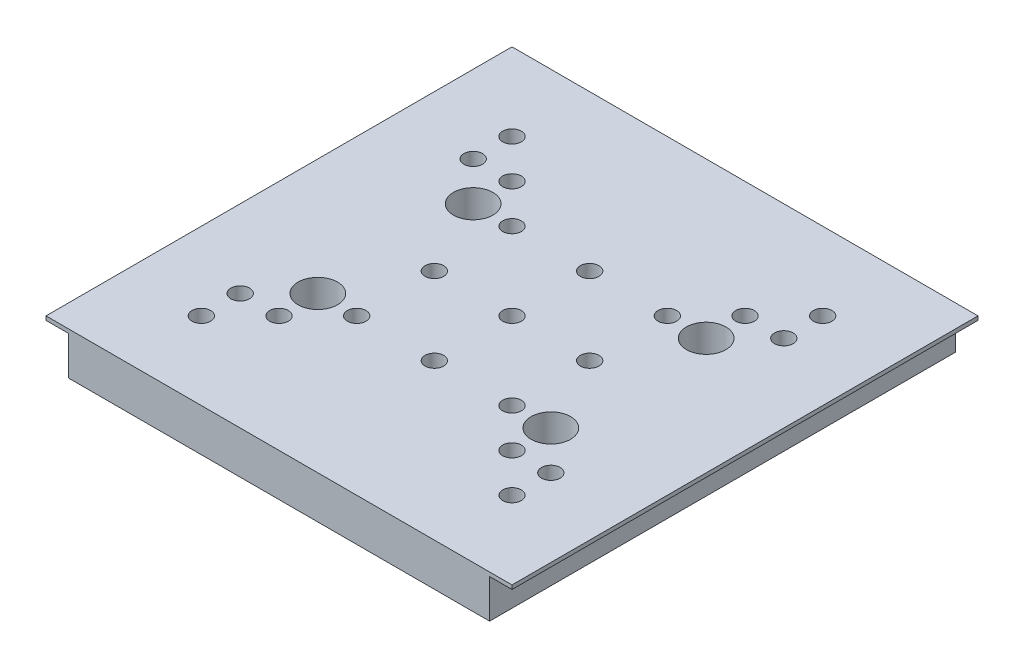
ISO-10303-21;
HEADER;
FILE_DESCRIPTION(('STEP AP214'),'2;1');
FILE_NAME('part.step','',(''),(''),'','','');
FILE_SCHEMA(('AUTOMOTIVE_DESIGN { 1 0 10303 214 1 1 1 1 }'));
ENDSEC;
DATA;
#1=APPLICATION_CONTEXT('core data for automotive mechanical design processes');
#2=APPLICATION_PROTOCOL_DEFINITION('international standard','automotive_design',2000,#1);
#3=PRODUCT_CONTEXT('',#1,'mechanical');
#4=PRODUCT('Part','Part','',(#3));
#5=PRODUCT_RELATED_PRODUCT_CATEGORY('part','',(#4));
#6=PRODUCT_DEFINITION_FORMATION('','',#4);
#7=PRODUCT_DEFINITION_CONTEXT('part definition',#1,'design');
#8=PRODUCT_DEFINITION('design','',#6,#7);
#9=PRODUCT_DEFINITION_SHAPE('','',#8);
#10=(LENGTH_UNIT() NAMED_UNIT(*) SI_UNIT(.MILLI.,.METRE.));
#11=(NAMED_UNIT(*) PLANE_ANGLE_UNIT() SI_UNIT($,.RADIAN.));
#12=(NAMED_UNIT(*) SI_UNIT($,.STERADIAN.) SOLID_ANGLE_UNIT());
#13=UNCERTAINTY_MEASURE_WITH_UNIT(LENGTH_MEASURE(1.E-05),#10,'distance_accuracy_value','');
#14=(GEOMETRIC_REPRESENTATION_CONTEXT(3) GLOBAL_UNCERTAINTY_ASSIGNED_CONTEXT((#13)) GLOBAL_UNIT_ASSIGNED_CONTEXT((#10,
#11,#12)) REPRESENTATION_CONTEXT('',''));
#15=CARTESIAN_POINT('',(0.,0.,0.));
#16=DIRECTION('',(0.,0.,1.));
#17=DIRECTION('',(1.,0.,0.));
#18=AXIS2_PLACEMENT_3D('',#15,#16,#17);
#19=CARTESIAN_POINT('',(75.,13.716,75.));
#20=DIRECTION('',(0.,-1.,0.));
#21=DIRECTION('',(0.,0.,-1.));
#22=AXIS2_PLACEMENT_3D('',#19,#20,#21);
#23=PLANE('',#22);
#24=CARTESIAN_POINT('',(50.,13.716,37.5));
#25=DIRECTION('',(0.,1.,0.));
#26=DIRECTION('',(0.,0.,1.));
#27=AXIS2_PLACEMENT_3D('',#24,#25,#26);
#28=CIRCLE('',#27,2.99999999999999);
#29=CARTESIAN_POINT('',(50.,13.716,40.5));
#30=VERTEX_POINT('',#29);
#31=EDGE_CURVE('E252',#30,#30,#28,.T.);
#32=ORIENTED_EDGE('',*,*,#31,.F.);
#33=EDGE_LOOP('',(#32));
#34=FACE_BOUND('',#33,.T.);
#35=CARTESIAN_POINT('',(25.,13.716,25.));
#36=DIRECTION('',(0.,1.,0.));
#37=DIRECTION('',(0.,0.,1.));
#38=AXIS2_PLACEMENT_3D('',#35,#36,#37);
#39=CIRCLE('',#38,2.99999999999999);
#40=CARTESIAN_POINT('',(25.,13.716,28.));
#41=VERTEX_POINT('',#40);
#42=EDGE_CURVE('E267',#41,#41,#39,.T.);
#43=ORIENTED_EDGE('',*,*,#42,.F.);
#44=EDGE_LOOP('',(#43));
#45=FACE_BOUND('',#44,.T.);
#46=CARTESIAN_POINT('',(50.,13.716,-37.5));
#47=DIRECTION('',(0.,1.,0.));
#48=DIRECTION('',(0.,0.,1.));
#49=AXIS2_PLACEMENT_3D('',#46,#47,#48);
#50=CIRCLE('',#49,2.99999999999999);
#51=CARTESIAN_POINT('',(50.,13.716,-34.5));
#52=VERTEX_POINT('',#51);
#53=EDGE_CURVE('E274',#52,#52,#50,.T.);
#54=ORIENTED_EDGE('',*,*,#53,.F.);
#55=EDGE_LOOP('',(#54));
#56=FACE_BOUND('',#55,.T.);
#57=CARTESIAN_POINT('',(25.,13.716,-25.));
#58=DIRECTION('',(0.,1.,0.));
#59=DIRECTION('',(0.,0.,1.));
#60=AXIS2_PLACEMENT_3D('',#57,#58,#59);
#61=CIRCLE('',#60,2.99999999999999);
#62=CARTESIAN_POINT('',(25.,13.716,-22.));
#63=VERTEX_POINT('',#62);
#64=EDGE_CURVE('E287',#63,#63,#61,.T.);
#65=ORIENTED_EDGE('',*,*,#64,.F.);
#66=EDGE_LOOP('',(#65));
#67=FACE_BOUND('',#66,.T.);
#68=CARTESIAN_POINT('',(-37.5,13.716,37.5));
#69=DIRECTION('',(0.,1.,0.));
#70=DIRECTION('',(0.,0.,1.));
#71=AXIS2_PLACEMENT_3D('',#68,#69,#70);
#72=CIRCLE('',#71,2.99999999999999);
#73=CARTESIAN_POINT('',(-37.5,13.716,40.5));
#74=VERTEX_POINT('',#73);
#75=EDGE_CURVE('E294',#74,#74,#72,.T.);
#76=ORIENTED_EDGE('',*,*,#75,.F.);
#77=EDGE_LOOP('',(#76));
#78=FACE_BOUND('',#77,.T.);
#79=CARTESIAN_POINT('',(-50.,13.716,50.));
#80=DIRECTION('',(0.,1.,0.));
#81=DIRECTION('',(0.,0.,1.));
#82=AXIS2_PLACEMENT_3D('',#79,#80,#81);
#83=CIRCLE('',#82,2.99999999999999);
#84=CARTESIAN_POINT('',(-50.,13.716,53.));
#85=VERTEX_POINT('',#84);
#86=EDGE_CURVE('E304',#85,#85,#83,.T.);
#87=ORIENTED_EDGE('',*,*,#86,.F.);
#88=EDGE_LOOP('',(#87));
#89=FACE_BOUND('',#88,.T.);
#90=CARTESIAN_POINT('',(0.,13.716,25.));
#91=DIRECTION('',(0.,1.,0.));
#92=DIRECTION('',(0.,0.,1.));
#93=AXIS2_PLACEMENT_3D('',#90,#91,#92);
#94=CIRCLE('',#93,2.99999999999999);
#95=CARTESIAN_POINT('',(0.,13.716,28.));
#96=VERTEX_POINT('',#95);
#97=EDGE_CURVE('E317',#96,#96,#94,.T.);
#98=ORIENTED_EDGE('',*,*,#97,.F.);
#99=EDGE_LOOP('',(#98));
#100=FACE_BOUND('',#99,.T.);
#101=CARTESIAN_POINT('',(-50.,13.716,-37.5));
#102=DIRECTION('',(0.,1.,0.));
#103=DIRECTION('',(0.,0.,1.));
#104=AXIS2_PLACEMENT_3D('',#101,#102,#103);
#105=CIRCLE('',#104,2.99999999999999);
#106=CARTESIAN_POINT('',(-50.,13.716,-34.5));
#107=VERTEX_POINT('',#106);
#108=EDGE_CURVE('E324',#107,#107,#105,.T.);
#109=ORIENTED_EDGE('',*,*,#108,.F.);
#110=EDGE_LOOP('',(#109));
#111=FACE_BOUND('',#110,.T.);
#112=CARTESIAN_POINT('',(-25.,13.716,-25.));
#113=DIRECTION('',(0.,1.,0.));
#114=DIRECTION('',(0.,0.,1.));
#115=AXIS2_PLACEMENT_3D('',#112,#113,#114);
#116=CIRCLE('',#115,2.99999999999999);
#117=CARTESIAN_POINT('',(-25.,13.716,-22.));
#118=VERTEX_POINT('',#117);
#119=EDGE_CURVE('E11',#118,#118,#116,.T.);
#120=ORIENTED_EDGE('',*,*,#119,.F.);
#121=EDGE_LOOP('',(#120));
#122=FACE_BOUND('',#121,.T.);
#123=CARTESIAN_POINT('',(0.,13.716,-25.));
#124=DIRECTION('',(0.,1.,0.));
#125=DIRECTION('',(0.,0.,1.));
#126=AXIS2_PLACEMENT_3D('',#123,#124,#125);
#127=CIRCLE('',#126,2.99999999999999);
#128=CARTESIAN_POINT('',(0.,13.716,-22.));
#129=VERTEX_POINT('',#128);
#130=EDGE_CURVE('E166',#129,#129,#127,.T.);
#131=ORIENTED_EDGE('',*,*,#130,.F.);
#132=EDGE_LOOP('',(#131));
#133=FACE_BOUND('',#132,.T.);
#134=DIRECTION('',(-1.,0.,0.));
#135=VECTOR('',#134,1.);
#136=CARTESIAN_POINT('',(75.,13.716,-75.));
#137=LINE('',#136,#135);
#138=CARTESIAN_POINT('',(75.,13.716,-75.));
#139=VERTEX_POINT('',#138);
#140=CARTESIAN_POINT('',(-75.,13.716,-75.));
#141=VERTEX_POINT('',#140);
#142=EDGE_CURVE('E141',#139,#141,#137,.T.);
#143=ORIENTED_EDGE('',*,*,#142,.T.);
#144=DIRECTION('',(0.,0.,-1.));
#145=VECTOR('',#144,1.);
#146=CARTESIAN_POINT('',(-75.,13.716,75.));
#147=LINE('',#146,#145);
#148=CARTESIAN_POINT('',(-75.,13.716,75.));
#149=VERTEX_POINT('',#148);
#150=EDGE_CURVE('E152',#149,#141,#147,.T.);
#151=ORIENTED_EDGE('',*,*,#150,.F.);
#152=DIRECTION('',(-1.,0.,0.));
#153=VECTOR('',#152,1.);
#154=CARTESIAN_POINT('',(75.,13.716,75.));
#155=LINE('',#154,#153);
#156=CARTESIAN_POINT('',(75.,13.716,75.));
#157=VERTEX_POINT('',#156);
#158=EDGE_CURVE('E361',#157,#149,#155,.T.);
#159=ORIENTED_EDGE('',*,*,#158,.F.);
#160=DIRECTION('',(0.,0.,-1.));
#161=VECTOR('',#160,1.);
#162=CARTESIAN_POINT('',(75.,13.716,75.));
#163=LINE('',#162,#161);
#164=EDGE_CURVE('E155',#157,#139,#163,.T.);
#165=ORIENTED_EDGE('',*,*,#164,.T.);
#166=EDGE_LOOP('',(#143,#151,#159,#165));
#167=FACE_BOUND('',#166,.T.);
#168=CARTESIAN_POINT('',(-37.5,13.716,-25.));
#169=DIRECTION('',(0.,1.,0.));
#170=DIRECTION('',(0.,0.,1.));
#171=AXIS2_PLACEMENT_3D('',#168,#169,#170);
#172=CIRCLE('',#171,6.34999999999999);
#173=CARTESIAN_POINT('',(-37.5,13.716,-18.65));
#174=VERTEX_POINT('',#173);
#175=EDGE_CURVE('E192',#174,#174,#172,.T.);
#176=ORIENTED_EDGE('',*,*,#175,.F.);
#177=EDGE_LOOP('',(#176));
#178=FACE_BOUND('',#177,.T.);
#179=CARTESIAN_POINT('',(37.5,13.716,-25.));
#180=DIRECTION('',(0.,1.,0.));
#181=DIRECTION('',(0.,0.,1.));
#182=AXIS2_PLACEMENT_3D('',#179,#180,#181);
#183=CIRCLE('',#182,6.34999999999999);
#184=CARTESIAN_POINT('',(37.5,13.716,-18.65));
#185=VERTEX_POINT('',#184);
#186=EDGE_CURVE('E196',#185,#185,#183,.T.);
#187=ORIENTED_EDGE('',*,*,#186,.F.);
#188=EDGE_LOOP('',(#187));
#189=FACE_BOUND('',#188,.T.);
#190=CARTESIAN_POINT('',(37.5,13.716,25.));
#191=DIRECTION('',(0.,1.,0.));
#192=DIRECTION('',(0.,0.,1.));
#193=AXIS2_PLACEMENT_3D('',#190,#191,#192);
#194=CIRCLE('',#193,6.34999999999999);
#195=CARTESIAN_POINT('',(37.5,13.716,31.35));
#196=VERTEX_POINT('',#195);
#197=EDGE_CURVE('E200',#196,#196,#194,.T.);
#198=ORIENTED_EDGE('',*,*,#197,.F.);
#199=EDGE_LOOP('',(#198));
#200=FACE_BOUND('',#199,.T.);
#201=CARTESIAN_POINT('',(-37.5,13.716,25.));
#202=DIRECTION('',(0.,1.,0.));
#203=DIRECTION('',(0.,0.,1.));
#204=AXIS2_PLACEMENT_3D('',#201,#202,#203);
#205=CIRCLE('',#204,6.34999999999999);
#206=CARTESIAN_POINT('',(-37.5,13.716,31.35));
#207=VERTEX_POINT('',#206);
#208=EDGE_CURVE('E204',#207,#207,#205,.T.);
#209=ORIENTED_EDGE('',*,*,#208,.F.);
#210=EDGE_LOOP('',(#209));
#211=FACE_BOUND('',#210,.T.);
#212=CARTESIAN_POINT('',(0.,13.716,0.));
#213=DIRECTION('',(0.,1.,0.));
#214=DIRECTION('',(0.,0.,1.));
#215=AXIS2_PLACEMENT_3D('',#212,#213,#214);
#216=CIRCLE('',#215,2.99999999999999);
#217=CARTESIAN_POINT('',(0.,13.716,2.99999999999999));
#218=VERTEX_POINT('',#217);
#219=EDGE_CURVE('E208',#218,#218,#216,.T.);
#220=ORIENTED_EDGE('',*,*,#219,.F.);
#221=EDGE_LOOP('',(#220));
#222=FACE_BOUND('',#221,.T.);
#223=CARTESIAN_POINT('',(-25.,13.716,0.));
#224=DIRECTION('',(0.,1.,0.));
#225=DIRECTION('',(0.,0.,1.));
#226=AXIS2_PLACEMENT_3D('',#223,#224,#225);
#227=CIRCLE('',#226,2.99999999999999);
#228=CARTESIAN_POINT('',(-25.,13.716,2.99999999999999));
#229=VERTEX_POINT('',#228);
#230=EDGE_CURVE('E212',#229,#229,#227,.T.);
#231=ORIENTED_EDGE('',*,*,#230,.F.);
#232=EDGE_LOOP('',(#231));
#233=FACE_BOUND('',#232,.T.);
#234=CARTESIAN_POINT('',(-50.,13.716,-50.));
#235=DIRECTION('',(0.,1.,0.));
#236=DIRECTION('',(0.,0.,1.));
#237=AXIS2_PLACEMENT_3D('',#234,#235,#236);
#238=CIRCLE('',#237,2.99999999999999);
#239=CARTESIAN_POINT('',(-50.,13.716,-47.));
#240=VERTEX_POINT('',#239);
#241=EDGE_CURVE('E216',#240,#240,#238,.T.);
#242=ORIENTED_EDGE('',*,*,#241,.F.);
#243=EDGE_LOOP('',(#242));
#244=FACE_BOUND('',#243,.T.);
#245=CARTESIAN_POINT('',(-37.5,13.716,-37.5));
#246=DIRECTION('',(0.,1.,0.));
#247=DIRECTION('',(0.,0.,1.));
#248=AXIS2_PLACEMENT_3D('',#245,#246,#247);
#249=CIRCLE('',#248,2.99999999999999);
#250=CARTESIAN_POINT('',(-37.5,13.716,-34.5));
#251=VERTEX_POINT('',#250);
#252=EDGE_CURVE('E220',#251,#251,#249,.T.);
#253=ORIENTED_EDGE('',*,*,#252,.F.);
#254=EDGE_LOOP('',(#253));
#255=FACE_BOUND('',#254,.T.);
#256=CARTESIAN_POINT('',(-25.,13.716,25.));
#257=DIRECTION('',(0.,1.,0.));
#258=DIRECTION('',(0.,0.,1.));
#259=AXIS2_PLACEMENT_3D('',#256,#257,#258);
#260=CIRCLE('',#259,2.99999999999999);
#261=CARTESIAN_POINT('',(-25.,13.716,28.));
#262=VERTEX_POINT('',#261);
#263=EDGE_CURVE('E224',#262,#262,#260,.T.);
#264=ORIENTED_EDGE('',*,*,#263,.F.);
#265=EDGE_LOOP('',(#264));
#266=FACE_BOUND('',#265,.T.);
#267=CARTESIAN_POINT('',(-50.,13.716,37.5));
#268=DIRECTION('',(0.,1.,0.));
#269=DIRECTION('',(0.,0.,1.));
#270=AXIS2_PLACEMENT_3D('',#267,#268,#269);
#271=CIRCLE('',#270,2.99999999999999);
#272=CARTESIAN_POINT('',(-50.,13.716,40.5));
#273=VERTEX_POINT('',#272);
#274=EDGE_CURVE('E228',#273,#273,#271,.T.);
#275=ORIENTED_EDGE('',*,*,#274,.F.);
#276=EDGE_LOOP('',(#275));
#277=FACE_BOUND('',#276,.T.);
#278=CARTESIAN_POINT('',(25.,13.716,0.));
#279=DIRECTION('',(0.,1.,0.));
#280=DIRECTION('',(0.,0.,1.));
#281=AXIS2_PLACEMENT_3D('',#278,#279,#280);
#282=CIRCLE('',#281,2.99999999999999);
#283=CARTESIAN_POINT('',(25.,13.716,2.99999999999999));
#284=VERTEX_POINT('',#283);
#285=EDGE_CURVE('E232',#284,#284,#282,.T.);
#286=ORIENTED_EDGE('',*,*,#285,.F.);
#287=EDGE_LOOP('',(#286));
#288=FACE_BOUND('',#287,.T.);
#289=CARTESIAN_POINT('',(50.,13.716,-50.));
#290=DIRECTION('',(0.,1.,0.));
#291=DIRECTION('',(0.,0.,1.));
#292=AXIS2_PLACEMENT_3D('',#289,#290,#291);
#293=CIRCLE('',#292,2.99999999999999);
#294=CARTESIAN_POINT('',(50.,13.716,-47.));
#295=VERTEX_POINT('',#294);
#296=EDGE_CURVE('E236',#295,#295,#293,.T.);
#297=ORIENTED_EDGE('',*,*,#296,.F.);
#298=EDGE_LOOP('',(#297));
#299=FACE_BOUND('',#298,.T.);
#300=CARTESIAN_POINT('',(37.5,13.716,-37.5));
#301=DIRECTION('',(0.,1.,0.));
#302=DIRECTION('',(0.,0.,1.));
#303=AXIS2_PLACEMENT_3D('',#300,#301,#302);
#304=CIRCLE('',#303,2.99999999999999);
#305=CARTESIAN_POINT('',(37.5,13.716,-34.5));
#306=VERTEX_POINT('',#305);
#307=EDGE_CURVE('E240',#306,#306,#304,.T.);
#308=ORIENTED_EDGE('',*,*,#307,.F.);
#309=EDGE_LOOP('',(#308));
#310=FACE_BOUND('',#309,.T.);
#311=CARTESIAN_POINT('',(50.,13.716,50.));
#312=DIRECTION('',(0.,1.,0.));
#313=DIRECTION('',(0.,0.,1.));
#314=AXIS2_PLACEMENT_3D('',#311,#312,#313);
#315=CIRCLE('',#314,2.99999999999999);
#316=CARTESIAN_POINT('',(50.,13.716,53.));
#317=VERTEX_POINT('',#316);
#318=EDGE_CURVE('E244',#317,#317,#315,.T.);
#319=ORIENTED_EDGE('',*,*,#318,.F.);
#320=EDGE_LOOP('',(#319));
#321=FACE_BOUND('',#320,.T.);
#322=CARTESIAN_POINT('',(37.5,13.716,37.5));
#323=DIRECTION('',(0.,1.,0.));
#324=DIRECTION('',(0.,0.,1.));
#325=AXIS2_PLACEMENT_3D('',#322,#323,#324);
#326=CIRCLE('',#325,2.99999999999999);
#327=CARTESIAN_POINT('',(37.5,13.716,40.5));
#328=VERTEX_POINT('',#327);
#329=EDGE_CURVE('E247',#328,#328,#326,.T.);
#330=ORIENTED_EDGE('',*,*,#329,.F.);
#331=EDGE_LOOP('',(#330));
#332=FACE_BOUND('',#331,.T.);
#333=ADVANCED_FACE('F35',(#34,#45,#56,#67,#78,#89,#100,#111,#122,#133,#167,#178,#189,#200,#211,
#222,#233,#244,#255,#266,#277,#288,#299,#310,#321,#332),#23,.F.);
#334=CARTESIAN_POINT('',(67.79,0.,75.));
#335=DIRECTION('',(-1.,0.,0.));
#336=DIRECTION('',(0.,0.,1.));
#337=AXIS2_PLACEMENT_3D('',#334,#335,#336);
#338=PLANE('',#337);
#339=DIRECTION('',(0.,1.,0.));
#340=VECTOR('',#339,1.);
#341=CARTESIAN_POINT('',(67.79,0.,-75.));
#342=LINE('',#341,#340);
#343=CARTESIAN_POINT('',(67.79,0.,-75.));
#344=VERTEX_POINT('',#343);
#345=CARTESIAN_POINT('',(67.79,12.446,-75.));
#346=VERTEX_POINT('',#345);
#347=EDGE_CURVE('E133',#344,#346,#342,.T.);
#348=ORIENTED_EDGE('',*,*,#347,.T.);
#349=DIRECTION('',(0.,0.,-1.));
#350=VECTOR('',#349,1.);
#351=CARTESIAN_POINT('',(67.79,12.446,75.));
#352=LINE('',#351,#350);
#353=CARTESIAN_POINT('',(67.79,12.446,75.));
#354=VERTEX_POINT('',#353);
#355=EDGE_CURVE('E161',#354,#346,#352,.T.);
#356=ORIENTED_EDGE('',*,*,#355,.F.);
#357=DIRECTION('',(0.,1.,0.));
#358=VECTOR('',#357,1.);
#359=CARTESIAN_POINT('',(67.79,0.,75.));
#360=LINE('',#359,#358);
#361=CARTESIAN_POINT('',(67.79,0.,75.));
#362=VERTEX_POINT('',#361);
#363=EDGE_CURVE('E148',#362,#354,#360,.T.);
#364=ORIENTED_EDGE('',*,*,#363,.F.);
#365=DIRECTION('',(0.,0.,-1.));
#366=VECTOR('',#365,1.);
#367=CARTESIAN_POINT('',(67.79,0.,75.));
#368=LINE('',#367,#366);
#369=EDGE_CURVE('E129',#362,#344,#368,.T.);
#370=ORIENTED_EDGE('',*,*,#369,.T.);
#371=EDGE_LOOP('',(#348,#356,#364,#370));
#372=FACE_BOUND('',#371,.T.);
#373=ADVANCED_FACE('F181',(#372),#338,.F.);
#374=CARTESIAN_POINT('',(67.79,12.446,75.));
#375=DIRECTION('',(0.,1.,0.));
#376=DIRECTION('',(0.,0.,1.));
#377=AXIS2_PLACEMENT_3D('',#374,#375,#376);
#378=PLANE('',#377);
#379=DIRECTION('',(1.,0.,0.));
#380=VECTOR('',#379,1.);
#381=CARTESIAN_POINT('',(67.79,12.446,-75.));
#382=LINE('',#381,#380);
#383=CARTESIAN_POINT('',(75.,12.446,-75.));
#384=VERTEX_POINT('',#383);
#385=EDGE_CURVE('E136',#346,#384,#382,.T.);
#386=ORIENTED_EDGE('',*,*,#385,.T.);
#387=DIRECTION('',(0.,0.,-1.));
#388=VECTOR('',#387,1.);
#389=CARTESIAN_POINT('',(75.,12.446,75.));
#390=LINE('',#389,#388);
#391=CARTESIAN_POINT('',(75.,12.446,75.));
#392=VERTEX_POINT('',#391);
#393=EDGE_CURVE('E158',#392,#384,#390,.T.);
#394=ORIENTED_EDGE('',*,*,#393,.F.);
#395=DIRECTION('',(1.,0.,0.));
#396=VECTOR('',#395,1.);
#397=CARTESIAN_POINT('',(67.79,12.446,75.));
#398=LINE('',#397,#396);
#399=EDGE_CURVE('E96',#354,#392,#398,.T.);
#400=ORIENTED_EDGE('',*,*,#399,.F.);
#401=ORIENTED_EDGE('',*,*,#355,.T.);
#402=EDGE_LOOP('',(#386,#394,#400,#401));
#403=FACE_BOUND('',#402,.T.);
#404=ADVANCED_FACE('F393',(#403),#378,.F.);
#405=CARTESIAN_POINT('',(75.,12.446,75.));
#406=DIRECTION('',(-1.,0.,0.));
#407=DIRECTION('',(0.,0.,1.));
#408=AXIS2_PLACEMENT_3D('',#405,#406,#407);
#409=PLANE('',#408);
#410=DIRECTION('',(0.,1.,0.));
#411=VECTOR('',#410,1.);
#412=CARTESIAN_POINT('',(75.,12.446,-75.));
#413=LINE('',#412,#411);
#414=EDGE_CURVE('E139',#384,#139,#413,.T.);
#415=ORIENTED_EDGE('',*,*,#414,.T.);
#416=ORIENTED_EDGE('',*,*,#164,.F.);
#417=DIRECTION('',(0.,1.,0.));
#418=VECTOR('',#417,1.);
#419=CARTESIAN_POINT('',(75.,12.446,75.));
#420=LINE('',#419,#418);
#421=EDGE_CURVE('E359',#392,#157,#420,.T.);
#422=ORIENTED_EDGE('',*,*,#421,.F.);
#423=ORIENTED_EDGE('',*,*,#393,.T.);
#424=EDGE_LOOP('',(#415,#416,#422,#423));
#425=FACE_BOUND('',#424,.T.);
#426=ADVANCED_FACE('F396',(#425),#409,.F.);
#427=CARTESIAN_POINT('',(-75.,12.446,75.));
#428=DIRECTION('',(1.,0.,0.));
#429=DIRECTION('',(0.,0.,-1.));
#430=AXIS2_PLACEMENT_3D('',#427,#428,#429);
#431=PLANE('',#430);
#432=DIRECTION('',(0.,-1.,0.));
#433=VECTOR('',#432,1.);
#434=CARTESIAN_POINT('',(-75.,12.446,-75.));
#435=LINE('',#434,#433);
#436=CARTESIAN_POINT('',(-75.,12.446,-75.));
#437=VERTEX_POINT('',#436);
#438=EDGE_CURVE('E143',#141,#437,#435,.T.);
#439=ORIENTED_EDGE('',*,*,#438,.T.);
#440=DIRECTION('',(0.,0.,-1.));
#441=VECTOR('',#440,1.);
#442=CARTESIAN_POINT('',(-75.,12.446,75.));
#443=LINE('',#442,#441);
#444=CARTESIAN_POINT('',(-75.,12.446,75.));
#445=VERTEX_POINT('',#444);
#446=EDGE_CURVE('E124',#445,#437,#443,.T.);
#447=ORIENTED_EDGE('',*,*,#446,.F.);
#448=DIRECTION('',(0.,-1.,0.));
#449=VECTOR('',#448,1.);
#450=CARTESIAN_POINT('',(-75.,12.446,75.));
#451=LINE('',#450,#449);
#452=EDGE_CURVE('E115',#149,#445,#451,.T.);
#453=ORIENTED_EDGE('',*,*,#452,.F.);
#454=ORIENTED_EDGE('',*,*,#150,.T.);
#455=EDGE_LOOP('',(#439,#447,#453,#454));
#456=FACE_BOUND('',#455,.T.);
#457=ADVANCED_FACE('F367',(#456),#431,.F.);
#458=CARTESIAN_POINT('',(-67.79,12.446,75.));
#459=DIRECTION('',(0.,1.,0.));
#460=DIRECTION('',(0.,0.,1.));
#461=AXIS2_PLACEMENT_3D('',#458,#459,#460);
#462=PLANE('',#461);
#463=DIRECTION('',(1.,0.,0.));
#464=VECTOR('',#463,1.);
#465=CARTESIAN_POINT('',(-67.79,12.446,-75.));
#466=LINE('',#465,#464);
#467=CARTESIAN_POINT('',(-67.79,12.446,-75.));
#468=VERTEX_POINT('',#467);
#469=EDGE_CURVE('E123',#437,#468,#466,.T.);
#470=ORIENTED_EDGE('',*,*,#469,.T.);
#471=DIRECTION('',(0.,0.,-1.));
#472=VECTOR('',#471,1.);
#473=CARTESIAN_POINT('',(-67.79,12.446,75.));
#474=LINE('',#473,#472);
#475=CARTESIAN_POINT('',(-67.79,12.446,75.));
#476=VERTEX_POINT('',#475);
#477=EDGE_CURVE('E120',#476,#468,#474,.T.);
#478=ORIENTED_EDGE('',*,*,#477,.F.);
#479=DIRECTION('',(1.,0.,0.));
#480=VECTOR('',#479,1.);
#481=CARTESIAN_POINT('',(-67.79,12.446,75.));
#482=LINE('',#481,#480);
#483=EDGE_CURVE('E109',#445,#476,#482,.T.);
#484=ORIENTED_EDGE('',*,*,#483,.F.);
#485=ORIENTED_EDGE('',*,*,#446,.T.);
#486=EDGE_LOOP('',(#470,#478,#484,#485));
#487=FACE_BOUND('',#486,.T.);
#488=ADVANCED_FACE('F121',(#487),#462,.F.);
#489=CARTESIAN_POINT('',(-67.79,0.,75.));
#490=DIRECTION('',(1.,0.,0.));
#491=DIRECTION('',(0.,0.,-1.));
#492=AXIS2_PLACEMENT_3D('',#489,#490,#491);
#493=PLANE('',#492);
#494=DIRECTION('',(0.,-1.,0.));
#495=VECTOR('',#494,1.);
#496=CARTESIAN_POINT('',(-67.79,0.,-75.));
#497=LINE('',#496,#495);
#498=CARTESIAN_POINT('',(-67.79,0.,-75.));
#499=VERTEX_POINT('',#498);
#500=EDGE_CURVE('E81',#468,#499,#497,.T.);
#501=ORIENTED_EDGE('',*,*,#500,.T.);
#502=DIRECTION('',(0.,0.,-1.));
#503=VECTOR('',#502,1.);
#504=CARTESIAN_POINT('',(-67.79,0.,75.));
#505=LINE('',#504,#503);
#506=CARTESIAN_POINT('',(-67.79,0.,75.));
#507=VERTEX_POINT('',#506);
#508=EDGE_CURVE('E125',#507,#499,#505,.T.);
#509=ORIENTED_EDGE('',*,*,#508,.F.);
#510=DIRECTION('',(0.,-1.,0.));
#511=VECTOR('',#510,1.);
#512=CARTESIAN_POINT('',(-67.79,0.,75.));
#513=LINE('',#512,#511);
#514=EDGE_CURVE('E113',#476,#507,#513,.T.);
#515=ORIENTED_EDGE('',*,*,#514,.F.);
#516=ORIENTED_EDGE('',*,*,#477,.T.);
#517=EDGE_LOOP('',(#501,#509,#515,#516));
#518=FACE_BOUND('',#517,.T.);
#519=ADVANCED_FACE('F127',(#518),#493,.F.);
#520=CARTESIAN_POINT('',(-67.79,0.,75.));
#521=DIRECTION('',(0.,1.,0.));
#522=DIRECTION('',(0.,0.,1.));
#523=AXIS2_PLACEMENT_3D('',#520,#521,#522);
#524=PLANE('',#523);
#525=CARTESIAN_POINT('',(37.5,0.,37.5));
#526=DIRECTION('',(0.,1.,0.));
#527=DIRECTION('',(0.,0.,1.));
#528=AXIS2_PLACEMENT_3D('',#525,#526,#527);
#529=CIRCLE('',#528,2.99999999999999);
#530=CARTESIAN_POINT('',(37.5,0.,40.5));
#531=VERTEX_POINT('',#530);
#532=EDGE_CURVE('E249',#531,#531,#529,.T.);
#533=ORIENTED_EDGE('',*,*,#532,.T.);
#534=EDGE_LOOP('',(#533));
#535=FACE_BOUND('',#534,.T.);
#536=CARTESIAN_POINT('',(50.,0.,37.5));
#537=DIRECTION('',(0.,1.,0.));
#538=DIRECTION('',(0.,0.,1.));
#539=AXIS2_PLACEMENT_3D('',#536,#537,#538);
#540=CIRCLE('',#539,2.99999999999999);
#541=CARTESIAN_POINT('',(50.,0.,40.5));
#542=VERTEX_POINT('',#541);
#543=EDGE_CURVE('E257',#542,#542,#540,.T.);
#544=ORIENTED_EDGE('',*,*,#543,.T.);
#545=EDGE_LOOP('',(#544));
#546=FACE_BOUND('',#545,.T.);
#547=CARTESIAN_POINT('',(50.,0.,50.));
#548=DIRECTION('',(0.,1.,0.));
#549=DIRECTION('',(0.,0.,1.));
#550=AXIS2_PLACEMENT_3D('',#547,#548,#549);
#551=CIRCLE('',#550,2.99999999999999);
#552=CARTESIAN_POINT('',(50.,0.,53.));
#553=VERTEX_POINT('',#552);
#554=EDGE_CURVE('E261',#553,#553,#551,.T.);
#555=ORIENTED_EDGE('',*,*,#554,.T.);
#556=EDGE_LOOP('',(#555));
#557=FACE_BOUND('',#556,.T.);
#558=CARTESIAN_POINT('',(25.,0.,25.));
#559=DIRECTION('',(0.,1.,0.));
#560=DIRECTION('',(0.,0.,1.));
#561=AXIS2_PLACEMENT_3D('',#558,#559,#560);
#562=CIRCLE('',#561,3.);
#563=CARTESIAN_POINT('',(25.,0.,28.));
#564=VERTEX_POINT('',#563);
#565=EDGE_CURVE('E264',#564,#564,#562,.T.);
#566=ORIENTED_EDGE('',*,*,#565,.T.);
#567=EDGE_LOOP('',(#566));
#568=FACE_BOUND('',#567,.T.);
#569=CARTESIAN_POINT('',(37.5,0.,-37.5));
#570=DIRECTION('',(0.,1.,0.));
#571=DIRECTION('',(0.,0.,1.));
#572=AXIS2_PLACEMENT_3D('',#569,#570,#571);
#573=CIRCLE('',#572,2.99999999999999);
#574=CARTESIAN_POINT('',(37.5,0.,-34.5));
#575=VERTEX_POINT('',#574);
#576=EDGE_CURVE('E271',#575,#575,#573,.T.);
#577=ORIENTED_EDGE('',*,*,#576,.T.);
#578=EDGE_LOOP('',(#577));
#579=FACE_BOUND('',#578,.T.);
#580=CARTESIAN_POINT('',(50.,0.,-37.5));
#581=DIRECTION('',(0.,1.,0.));
#582=DIRECTION('',(0.,0.,1.));
#583=AXIS2_PLACEMENT_3D('',#580,#581,#582);
#584=CIRCLE('',#583,2.99999999999999);
#585=CARTESIAN_POINT('',(50.,0.,-34.5));
#586=VERTEX_POINT('',#585);
#587=EDGE_CURVE('E277',#586,#586,#584,.T.);
#588=ORIENTED_EDGE('',*,*,#587,.T.);
#589=EDGE_LOOP('',(#588));
#590=FACE_BOUND('',#589,.T.);
#591=CARTESIAN_POINT('',(50.,0.,-50.));
#592=DIRECTION('',(0.,1.,0.));
#593=DIRECTION('',(0.,0.,1.));
#594=AXIS2_PLACEMENT_3D('',#591,#592,#593);
#595=CIRCLE('',#594,2.99999999999999);
#596=CARTESIAN_POINT('',(50.,0.,-47.));
#597=VERTEX_POINT('',#596);
#598=EDGE_CURVE('E281',#597,#597,#595,.T.);
#599=ORIENTED_EDGE('',*,*,#598,.T.);
#600=EDGE_LOOP('',(#599));
#601=FACE_BOUND('',#600,.T.);
#602=CARTESIAN_POINT('',(25.,0.,-25.));
#603=DIRECTION('',(0.,1.,0.));
#604=DIRECTION('',(0.,0.,1.));
#605=AXIS2_PLACEMENT_3D('',#602,#603,#604);
#606=CIRCLE('',#605,3.);
#607=CARTESIAN_POINT('',(25.,0.,-22.));
#608=VERTEX_POINT('',#607);
#609=EDGE_CURVE('E284',#608,#608,#606,.T.);
#610=ORIENTED_EDGE('',*,*,#609,.T.);
#611=EDGE_LOOP('',(#610));
#612=FACE_BOUND('',#611,.T.);
#613=CARTESIAN_POINT('',(25.,0.,0.));
#614=DIRECTION('',(0.,1.,0.));
#615=DIRECTION('',(0.,0.,1.));
#616=AXIS2_PLACEMENT_3D('',#613,#614,#615);
#617=CIRCLE('',#616,3.);
#618=CARTESIAN_POINT('',(25.,0.,3.));
#619=VERTEX_POINT('',#618);
#620=EDGE_CURVE('E290',#619,#619,#617,.T.);
#621=ORIENTED_EDGE('',*,*,#620,.T.);
#622=EDGE_LOOP('',(#621));
#623=FACE_BOUND('',#622,.T.);
#624=CARTESIAN_POINT('',(-37.5,0.,37.5));
#625=DIRECTION('',(0.,1.,0.));
#626=DIRECTION('',(0.,0.,1.));
#627=AXIS2_PLACEMENT_3D('',#624,#625,#626);
#628=CIRCLE('',#627,2.99999999999999);
#629=CARTESIAN_POINT('',(-37.5,0.,40.5));
#630=VERTEX_POINT('',#629);
#631=EDGE_CURVE('E297',#630,#630,#628,.T.);
#632=ORIENTED_EDGE('',*,*,#631,.T.);
#633=EDGE_LOOP('',(#632));
#634=FACE_BOUND('',#633,.T.);
#635=CARTESIAN_POINT('',(-50.,0.,37.5));
#636=DIRECTION('',(0.,1.,0.));
#637=DIRECTION('',(0.,0.,1.));
#638=AXIS2_PLACEMENT_3D('',#635,#636,#637);
#639=CIRCLE('',#638,2.99999999999999);
#640=CARTESIAN_POINT('',(-50.,0.,40.5));
#641=VERTEX_POINT('',#640);
#642=EDGE_CURVE('E301',#641,#641,#639,.T.);
#643=ORIENTED_EDGE('',*,*,#642,.T.);
#644=EDGE_LOOP('',(#643));
#645=FACE_BOUND('',#644,.T.);
#646=CARTESIAN_POINT('',(-50.,0.,50.));
#647=DIRECTION('',(0.,1.,0.));
#648=DIRECTION('',(0.,0.,1.));
#649=AXIS2_PLACEMENT_3D('',#646,#647,#648);
#650=CIRCLE('',#649,2.99999999999999);
#651=CARTESIAN_POINT('',(-50.,0.,53.));
#652=VERTEX_POINT('',#651);
#653=EDGE_CURVE('E307',#652,#652,#650,.T.);
#654=ORIENTED_EDGE('',*,*,#653,.T.);
#655=EDGE_LOOP('',(#654));
#656=FACE_BOUND('',#655,.T.);
#657=CARTESIAN_POINT('',(-25.,0.,25.));
#658=DIRECTION('',(0.,1.,0.));
#659=DIRECTION('',(0.,0.,1.));
#660=AXIS2_PLACEMENT_3D('',#657,#658,#659);
#661=CIRCLE('',#660,3.);
#662=CARTESIAN_POINT('',(-25.,0.,28.));
#663=VERTEX_POINT('',#662);
#664=EDGE_CURVE('E310',#663,#663,#661,.T.);
#665=ORIENTED_EDGE('',*,*,#664,.T.);
#666=EDGE_LOOP('',(#665));
#667=FACE_BOUND('',#666,.T.);
#668=CARTESIAN_POINT('',(0.,0.,25.));
#669=DIRECTION('',(0.,1.,0.));
#670=DIRECTION('',(0.,0.,1.));
#671=AXIS2_PLACEMENT_3D('',#668,#669,#670);
#672=CIRCLE('',#671,3.);
#673=CARTESIAN_POINT('',(0.,0.,28.));
#674=VERTEX_POINT('',#673);
#675=EDGE_CURVE('E314',#674,#674,#672,.T.);
#676=ORIENTED_EDGE('',*,*,#675,.T.);
#677=EDGE_LOOP('',(#676));
#678=FACE_BOUND('',#677,.T.);
#679=CARTESIAN_POINT('',(-37.5,0.,-37.5));
#680=DIRECTION('',(0.,1.,0.));
#681=DIRECTION('',(0.,0.,1.));
#682=AXIS2_PLACEMENT_3D('',#679,#680,#681);
#683=CIRCLE('',#682,2.99999999999999);
#684=CARTESIAN_POINT('',(-37.5,0.,-34.5));
#685=VERTEX_POINT('',#684);
#686=EDGE_CURVE('E321',#685,#685,#683,.T.);
#687=ORIENTED_EDGE('',*,*,#686,.T.);
#688=EDGE_LOOP('',(#687));
#689=FACE_BOUND('',#688,.T.);
#690=CARTESIAN_POINT('',(-50.,0.,-37.5));
#691=DIRECTION('',(0.,1.,0.));
#692=DIRECTION('',(0.,0.,1.));
#693=AXIS2_PLACEMENT_3D('',#690,#691,#692);
#694=CIRCLE('',#693,2.99999999999999);
#695=CARTESIAN_POINT('',(-50.,0.,-34.5));
#696=VERTEX_POINT('',#695);
#697=EDGE_CURVE('E327',#696,#696,#694,.T.);
#698=ORIENTED_EDGE('',*,*,#697,.T.);
#699=EDGE_LOOP('',(#698));
#700=FACE_BOUND('',#699,.T.);
#701=CARTESIAN_POINT('',(-50.,0.,-50.));
#702=DIRECTION('',(0.,1.,0.));
#703=DIRECTION('',(0.,0.,1.));
#704=AXIS2_PLACEMENT_3D('',#701,#702,#703);
#705=CIRCLE('',#704,2.99999999999999);
#706=CARTESIAN_POINT('',(-50.,0.,-47.));
#707=VERTEX_POINT('',#706);
#708=EDGE_CURVE('E331',#707,#707,#705,.T.);
#709=ORIENTED_EDGE('',*,*,#708,.T.);
#710=EDGE_LOOP('',(#709));
#711=FACE_BOUND('',#710,.T.);
#712=CARTESIAN_POINT('',(-25.,0.,0.));
#713=DIRECTION('',(0.,1.,0.));
#714=DIRECTION('',(0.,0.,1.));
#715=AXIS2_PLACEMENT_3D('',#712,#713,#714);
#716=CIRCLE('',#715,3.);
#717=CARTESIAN_POINT('',(-25.,0.,3.));
#718=VERTEX_POINT('',#717);
#719=EDGE_CURVE('E334',#718,#718,#716,.T.);
#720=ORIENTED_EDGE('',*,*,#719,.T.);
#721=EDGE_LOOP('',(#720));
#722=FACE_BOUND('',#721,.T.);
#723=CARTESIAN_POINT('',(0.,0.,0.));
#724=DIRECTION('',(0.,1.,0.));
#725=DIRECTION('',(0.,0.,1.));
#726=AXIS2_PLACEMENT_3D('',#723,#724,#725);
#727=CIRCLE('',#726,3.);
#728=CARTESIAN_POINT('',(0.,0.,3.));
#729=VERTEX_POINT('',#728);
#730=EDGE_CURVE('E338',#729,#729,#727,.T.);
#731=ORIENTED_EDGE('',*,*,#730,.T.);
#732=EDGE_LOOP('',(#731));
#733=FACE_BOUND('',#732,.T.);
#734=CARTESIAN_POINT('',(-37.5,0.,25.));
#735=DIRECTION('',(0.,1.,0.));
#736=DIRECTION('',(0.,0.,1.));
#737=AXIS2_PLACEMENT_3D('',#734,#735,#736);
#738=CIRCLE('',#737,6.34999999999999);
#739=CARTESIAN_POINT('',(-37.5,0.,31.35));
#740=VERTEX_POINT('',#739);
#741=EDGE_CURVE('E343',#740,#740,#738,.T.);
#742=ORIENTED_EDGE('',*,*,#741,.T.);
#743=EDGE_LOOP('',(#742));
#744=FACE_BOUND('',#743,.T.);
#745=CARTESIAN_POINT('',(37.5,0.,25.));
#746=DIRECTION('',(0.,1.,0.));
#747=DIRECTION('',(0.,0.,1.));
#748=AXIS2_PLACEMENT_3D('',#745,#746,#747);
#749=CIRCLE('',#748,6.34999999999999);
#750=CARTESIAN_POINT('',(37.5,0.,31.35));
#751=VERTEX_POINT('',#750);
#752=EDGE_CURVE('E347',#751,#751,#749,.T.);
#753=ORIENTED_EDGE('',*,*,#752,.T.);
#754=EDGE_LOOP('',(#753));
#755=FACE_BOUND('',#754,.T.);
#756=CARTESIAN_POINT('',(37.5,0.,-25.));
#757=DIRECTION('',(0.,1.,0.));
#758=DIRECTION('',(0.,0.,1.));
#759=AXIS2_PLACEMENT_3D('',#756,#757,#758);
#760=CIRCLE('',#759,6.34999999999999);
#761=CARTESIAN_POINT('',(37.5,0.,-18.65));
#762=VERTEX_POINT('',#761);
#763=EDGE_CURVE('E351',#762,#762,#760,.T.);
#764=ORIENTED_EDGE('',*,*,#763,.T.);
#765=EDGE_LOOP('',(#764));
#766=FACE_BOUND('',#765,.T.);
#767=CARTESIAN_POINT('',(-37.5,0.,-25.));
#768=DIRECTION('',(0.,1.,0.));
#769=DIRECTION('',(0.,0.,1.));
#770=AXIS2_PLACEMENT_3D('',#767,#768,#769);
#771=CIRCLE('',#770,6.34999999999999);
#772=CARTESIAN_POINT('',(-37.5,0.,-18.65));
#773=VERTEX_POINT('',#772);
#774=EDGE_CURVE('E137',#773,#773,#771,.T.);
#775=ORIENTED_EDGE('',*,*,#774,.T.);
#776=EDGE_LOOP('',(#775));
#777=FACE_BOUND('',#776,.T.);
#778=DIRECTION('',(1.,0.,0.));
#779=VECTOR('',#778,1.);
#780=CARTESIAN_POINT('',(-67.79,0.,-75.));
#781=LINE('',#780,#779);
#782=EDGE_CURVE('E87',#499,#344,#781,.T.);
#783=ORIENTED_EDGE('',*,*,#782,.T.);
#784=ORIENTED_EDGE('',*,*,#369,.F.);
#785=DIRECTION('',(1.,0.,0.));
#786=VECTOR('',#785,1.);
#787=CARTESIAN_POINT('',(-67.79,0.,75.));
#788=LINE('',#787,#786);
#789=EDGE_CURVE('E52',#507,#362,#788,.T.);
#790=ORIENTED_EDGE('',*,*,#789,.F.);
#791=ORIENTED_EDGE('',*,*,#508,.T.);
#792=EDGE_LOOP('',(#783,#784,#790,#791));
#793=FACE_BOUND('',#792,.T.);
#794=CARTESIAN_POINT('',(0.,0.,-25.));
#795=DIRECTION('',(0.,1.,0.));
#796=DIRECTION('',(0.,0.,1.));
#797=AXIS2_PLACEMENT_3D('',#794,#795,#796);
#798=CIRCLE('',#797,3.);
#799=CARTESIAN_POINT('',(0.,0.,-22.));
#800=VERTEX_POINT('',#799);
#801=EDGE_CURVE('E163',#800,#800,#798,.T.);
#802=ORIENTED_EDGE('',*,*,#801,.T.);
#803=EDGE_LOOP('',(#802));
#804=FACE_BOUND('',#803,.T.);
#805=CARTESIAN_POINT('',(-25.,0.,-25.));
#806=DIRECTION('',(0.,1.,0.));
#807=DIRECTION('',(0.,0.,1.));
#808=AXIS2_PLACEMENT_3D('',#805,#806,#807);
#809=CIRCLE('',#808,3.);
#810=CARTESIAN_POINT('',(-25.,0.,-22.));
#811=VERTEX_POINT('',#810);
#812=EDGE_CURVE('E44',#811,#811,#809,.T.);
#813=ORIENTED_EDGE('',*,*,#812,.T.);
#814=EDGE_LOOP('',(#813));
#815=FACE_BOUND('',#814,.T.);
#816=ADVANCED_FACE('F171',(#535,#546,#557,#568,#579,#590,#601,#612,#623,#634,#645,#656,#667,
#678,#689,#700,#711,#722,#733,#744,#755,#766,#777,#793,#804,#815),#524,.F.);
#817=CARTESIAN_POINT('',(67.79,12.446,75.));
#818=DIRECTION('',(0.,0.,-1.));
#819=DIRECTION('',(-1.,0.,0.));
#820=AXIS2_PLACEMENT_3D('',#817,#818,#819);
#821=PLANE('',#820);
#822=ORIENTED_EDGE('',*,*,#363,.T.);
#823=ORIENTED_EDGE('',*,*,#399,.T.);
#824=ORIENTED_EDGE('',*,*,#421,.T.);
#825=ORIENTED_EDGE('',*,*,#158,.T.);
#826=ORIENTED_EDGE('',*,*,#452,.T.);
#827=ORIENTED_EDGE('',*,*,#483,.T.);
#828=ORIENTED_EDGE('',*,*,#514,.T.);
#829=ORIENTED_EDGE('',*,*,#789,.T.);
#830=EDGE_LOOP('',(#822,#823,#824,#825,#826,#827,#828,#829));
#831=FACE_BOUND('',#830,.T.);
#832=ADVANCED_FACE('F111',(#831),#821,.F.);
#833=CARTESIAN_POINT('',(67.79,12.446,-75.));
#834=DIRECTION('',(0.,0.,-1.));
#835=DIRECTION('',(-1.,0.,0.));
#836=AXIS2_PLACEMENT_3D('',#833,#834,#835);
#837=PLANE('',#836);
#838=ORIENTED_EDGE('',*,*,#347,.F.);
#839=ORIENTED_EDGE('',*,*,#782,.F.);
#840=ORIENTED_EDGE('',*,*,#500,.F.);
#841=ORIENTED_EDGE('',*,*,#469,.F.);
#842=ORIENTED_EDGE('',*,*,#438,.F.);
#843=ORIENTED_EDGE('',*,*,#142,.F.);
#844=ORIENTED_EDGE('',*,*,#414,.F.);
#845=ORIENTED_EDGE('',*,*,#385,.F.);
#846=EDGE_LOOP('',(#838,#839,#840,#841,#842,#843,#844,#845));
#847=FACE_BOUND('',#846,.T.);
#848=ADVANCED_FACE('F370',(#847),#837,.T.);
#849=CARTESIAN_POINT('',(-37.5,13.716,-25.));
#850=DIRECTION('',(0.,1.,0.));
#851=DIRECTION('',(0.,0.,1.));
#852=AXIS2_PLACEMENT_3D('',#849,#850,#851);
#853=CYLINDRICAL_SURFACE('',#852,6.34999999999999);
#854=ORIENTED_EDGE('',*,*,#774,.F.);
#855=EDGE_LOOP('',(#854));
#856=FACE_BOUND('',#855,.T.);
#857=ORIENTED_EDGE('',*,*,#175,.T.);
#858=EDGE_LOOP('',(#857));
#859=FACE_BOUND('',#858,.T.);
#860=ADVANCED_FACE('F408',(#856,#859),#853,.F.);
#861=CARTESIAN_POINT('',(37.5,13.716,-25.));
#862=DIRECTION('',(0.,1.,0.));
#863=DIRECTION('',(0.,0.,1.));
#864=AXIS2_PLACEMENT_3D('',#861,#862,#863);
#865=CYLINDRICAL_SURFACE('',#864,6.34999999999999);
#866=ORIENTED_EDGE('',*,*,#763,.F.);
#867=EDGE_LOOP('',(#866));
#868=FACE_BOUND('',#867,.T.);
#869=ORIENTED_EDGE('',*,*,#186,.T.);
#870=EDGE_LOOP('',(#869));
#871=FACE_BOUND('',#870,.T.);
#872=ADVANCED_FACE('F413',(#868,#871),#865,.F.);
#873=CARTESIAN_POINT('',(37.5,13.716,25.));
#874=DIRECTION('',(0.,1.,0.));
#875=DIRECTION('',(0.,0.,1.));
#876=AXIS2_PLACEMENT_3D('',#873,#874,#875);
#877=CYLINDRICAL_SURFACE('',#876,6.34999999999999);
#878=ORIENTED_EDGE('',*,*,#752,.F.);
#879=EDGE_LOOP('',(#878));
#880=FACE_BOUND('',#879,.T.);
#881=ORIENTED_EDGE('',*,*,#197,.T.);
#882=EDGE_LOOP('',(#881));
#883=FACE_BOUND('',#882,.T.);
#884=ADVANCED_FACE('F417',(#880,#883),#877,.F.);
#885=CARTESIAN_POINT('',(-37.5,13.716,25.));
#886=DIRECTION('',(0.,1.,0.));
#887=DIRECTION('',(0.,0.,1.));
#888=AXIS2_PLACEMENT_3D('',#885,#886,#887);
#889=CYLINDRICAL_SURFACE('',#888,6.34999999999999);
#890=ORIENTED_EDGE('',*,*,#741,.F.);
#891=EDGE_LOOP('',(#890));
#892=FACE_BOUND('',#891,.T.);
#893=ORIENTED_EDGE('',*,*,#208,.T.);
#894=EDGE_LOOP('',(#893));
#895=FACE_BOUND('',#894,.T.);
#896=ADVANCED_FACE('F421',(#892,#895),#889,.F.);
#897=CARTESIAN_POINT('',(0.,13.716,0.));
#898=DIRECTION('',(0.,1.,0.));
#899=DIRECTION('',(0.,0.,1.));
#900=AXIS2_PLACEMENT_3D('',#897,#898,#899);
#901=CYLINDRICAL_SURFACE('',#900,2.99999999999999);
#902=ORIENTED_EDGE('',*,*,#730,.F.);
#903=EDGE_LOOP('',(#902));
#904=FACE_BOUND('',#903,.T.);
#905=ORIENTED_EDGE('',*,*,#219,.T.);
#906=EDGE_LOOP('',(#905));
#907=FACE_BOUND('',#906,.T.);
#908=ADVANCED_FACE('F387',(#904,#907),#901,.F.);
#909=CARTESIAN_POINT('',(-25.,13.716,0.));
#910=DIRECTION('',(0.,1.,0.));
#911=DIRECTION('',(0.,0.,1.));
#912=AXIS2_PLACEMENT_3D('',#909,#910,#911);
#913=CYLINDRICAL_SURFACE('',#912,2.99999999999999);
#914=ORIENTED_EDGE('',*,*,#719,.F.);
#915=EDGE_LOOP('',(#914));
#916=FACE_BOUND('',#915,.T.);
#917=ORIENTED_EDGE('',*,*,#230,.T.);
#918=EDGE_LOOP('',(#917));
#919=FACE_BOUND('',#918,.T.);
#920=ADVANCED_FACE('F383',(#916,#919),#913,.F.);
#921=CARTESIAN_POINT('',(0.,13.716,-25.));
#922=DIRECTION('',(0.,1.,0.));
#923=DIRECTION('',(0.,0.,1.));
#924=AXIS2_PLACEMENT_3D('',#921,#922,#923);
#925=CYLINDRICAL_SURFACE('',#924,2.99999999999999);
#926=ORIENTED_EDGE('',*,*,#801,.F.);
#927=EDGE_LOOP('',(#926));
#928=FACE_BOUND('',#927,.T.);
#929=ORIENTED_EDGE('',*,*,#130,.T.);
#930=EDGE_LOOP('',(#929));
#931=FACE_BOUND('',#930,.T.);
#932=ADVANCED_FACE('F176',(#928,#931),#925,.F.);
#933=CARTESIAN_POINT('',(-25.,13.716,-25.));
#934=DIRECTION('',(0.,1.,0.));
#935=DIRECTION('',(0.,0.,1.));
#936=AXIS2_PLACEMENT_3D('',#933,#934,#935);
#937=CYLINDRICAL_SURFACE('',#936,2.99999999999999);
#938=ORIENTED_EDGE('',*,*,#812,.F.);
#939=EDGE_LOOP('',(#938));
#940=FACE_BOUND('',#939,.T.);
#941=ORIENTED_EDGE('',*,*,#119,.T.);
#942=EDGE_LOOP('',(#941));
#943=FACE_BOUND('',#942,.T.);
#944=ADVANCED_FACE('F37',(#940,#943),#937,.F.);
#945=CARTESIAN_POINT('',(-50.,13.716,-50.));
#946=DIRECTION('',(0.,1.,0.));
#947=DIRECTION('',(0.,0.,1.));
#948=AXIS2_PLACEMENT_3D('',#945,#946,#947);
#949=CYLINDRICAL_SURFACE('',#948,2.99999999999999);
#950=ORIENTED_EDGE('',*,*,#708,.F.);
#951=EDGE_LOOP('',(#950));
#952=FACE_BOUND('',#951,.T.);
#953=ORIENTED_EDGE('',*,*,#241,.T.);
#954=EDGE_LOOP('',(#953));
#955=FACE_BOUND('',#954,.T.);
#956=ADVANCED_FACE('F175',(#952,#955),#949,.F.);
#957=CARTESIAN_POINT('',(-50.,13.716,-37.5));
#958=DIRECTION('',(0.,1.,0.));
#959=DIRECTION('',(0.,0.,1.));
#960=AXIS2_PLACEMENT_3D('',#957,#958,#959);
#961=CYLINDRICAL_SURFACE('',#960,2.99999999999999);
#962=ORIENTED_EDGE('',*,*,#697,.F.);
#963=EDGE_LOOP('',(#962));
#964=FACE_BOUND('',#963,.T.);
#965=ORIENTED_EDGE('',*,*,#108,.T.);
#966=EDGE_LOOP('',(#965));
#967=FACE_BOUND('',#966,.T.);
#968=ADVANCED_FACE('F431',(#964,#967),#961,.F.);
#969=CARTESIAN_POINT('',(-37.5,13.716,-37.5));
#970=DIRECTION('',(0.,1.,0.));
#971=DIRECTION('',(0.,0.,1.));
#972=AXIS2_PLACEMENT_3D('',#969,#970,#971);
#973=CYLINDRICAL_SURFACE('',#972,2.99999999999999);
#974=ORIENTED_EDGE('',*,*,#686,.F.);
#975=EDGE_LOOP('',(#974));
#976=FACE_BOUND('',#975,.T.);
#977=ORIENTED_EDGE('',*,*,#252,.T.);
#978=EDGE_LOOP('',(#977));
#979=FACE_BOUND('',#978,.T.);
#980=ADVANCED_FACE('F435',(#976,#979),#973,.F.);
#981=CARTESIAN_POINT('',(0.,13.716,25.));
#982=DIRECTION('',(0.,1.,0.));
#983=DIRECTION('',(0.,0.,1.));
#984=AXIS2_PLACEMENT_3D('',#981,#982,#983);
#985=CYLINDRICAL_SURFACE('',#984,2.99999999999999);
#986=ORIENTED_EDGE('',*,*,#675,.F.);
#987=EDGE_LOOP('',(#986));
#988=FACE_BOUND('',#987,.T.);
#989=ORIENTED_EDGE('',*,*,#97,.T.);
#990=EDGE_LOOP('',(#989));
#991=FACE_BOUND('',#990,.T.);
#992=ADVANCED_FACE('F439',(#988,#991),#985,.F.);
#993=CARTESIAN_POINT('',(-25.,13.716,25.));
#994=DIRECTION('',(0.,1.,0.));
#995=DIRECTION('',(0.,0.,1.));
#996=AXIS2_PLACEMENT_3D('',#993,#994,#995);
#997=CYLINDRICAL_SURFACE('',#996,2.99999999999999);
#998=ORIENTED_EDGE('',*,*,#664,.F.);
#999=EDGE_LOOP('',(#998));
#1000=FACE_BOUND('',#999,.T.);
#1001=ORIENTED_EDGE('',*,*,#263,.T.);
#1002=EDGE_LOOP('',(#1001));
#1003=FACE_BOUND('',#1002,.T.);
#1004=ADVANCED_FACE('F443',(#1000,#1003),#997,.F.);
#1005=CARTESIAN_POINT('',(-50.,13.716,50.));
#1006=DIRECTION('',(0.,1.,0.));
#1007=DIRECTION('',(0.,0.,1.));
#1008=AXIS2_PLACEMENT_3D('',#1005,#1006,#1007);
#1009=CYLINDRICAL_SURFACE('',#1008,2.99999999999999);
#1010=ORIENTED_EDGE('',*,*,#653,.F.);
#1011=EDGE_LOOP('',(#1010));
#1012=FACE_BOUND('',#1011,.T.);
#1013=ORIENTED_EDGE('',*,*,#86,.T.);
#1014=EDGE_LOOP('',(#1013));
#1015=FACE_BOUND('',#1014,.T.);
#1016=ADVANCED_FACE('F447',(#1012,#1015),#1009,.F.);
#1017=CARTESIAN_POINT('',(-50.,13.716,37.5));
#1018=DIRECTION('',(0.,1.,0.));
#1019=DIRECTION('',(0.,0.,1.));
#1020=AXIS2_PLACEMENT_3D('',#1017,#1018,#1019);
#1021=CYLINDRICAL_SURFACE('',#1020,2.99999999999999);
#1022=ORIENTED_EDGE('',*,*,#642,.F.);
#1023=EDGE_LOOP('',(#1022));
#1024=FACE_BOUND('',#1023,.T.);
#1025=ORIENTED_EDGE('',*,*,#274,.T.);
#1026=EDGE_LOOP('',(#1025));
#1027=FACE_BOUND('',#1026,.T.);
#1028=ADVANCED_FACE('F451',(#1024,#1027),#1021,.F.);
#1029=CARTESIAN_POINT('',(-37.5,13.716,37.5));
#1030=DIRECTION('',(0.,1.,0.));
#1031=DIRECTION('',(0.,0.,1.));
#1032=AXIS2_PLACEMENT_3D('',#1029,#1030,#1031);
#1033=CYLINDRICAL_SURFACE('',#1032,2.99999999999999);
#1034=ORIENTED_EDGE('',*,*,#631,.F.);
#1035=EDGE_LOOP('',(#1034));
#1036=FACE_BOUND('',#1035,.T.);
#1037=ORIENTED_EDGE('',*,*,#75,.T.);
#1038=EDGE_LOOP('',(#1037));
#1039=FACE_BOUND('',#1038,.T.);
#1040=ADVANCED_FACE('F455',(#1036,#1039),#1033,.F.);
#1041=CARTESIAN_POINT('',(25.,13.716,0.));
#1042=DIRECTION('',(0.,1.,0.));
#1043=DIRECTION('',(0.,0.,1.));
#1044=AXIS2_PLACEMENT_3D('',#1041,#1042,#1043);
#1045=CYLINDRICAL_SURFACE('',#1044,2.99999999999999);
#1046=ORIENTED_EDGE('',*,*,#620,.F.);
#1047=EDGE_LOOP('',(#1046));
#1048=FACE_BOUND('',#1047,.T.);
#1049=ORIENTED_EDGE('',*,*,#285,.T.);
#1050=EDGE_LOOP('',(#1049));
#1051=FACE_BOUND('',#1050,.T.);
#1052=ADVANCED_FACE('F459',(#1048,#1051),#1045,.F.);
#1053=CARTESIAN_POINT('',(25.,13.716,-25.));
#1054=DIRECTION('',(0.,1.,0.));
#1055=DIRECTION('',(0.,0.,1.));
#1056=AXIS2_PLACEMENT_3D('',#1053,#1054,#1055);
#1057=CYLINDRICAL_SURFACE('',#1056,2.99999999999999);
#1058=ORIENTED_EDGE('',*,*,#609,.F.);
#1059=EDGE_LOOP('',(#1058));
#1060=FACE_BOUND('',#1059,.T.);
#1061=ORIENTED_EDGE('',*,*,#64,.T.);
#1062=EDGE_LOOP('',(#1061));
#1063=FACE_BOUND('',#1062,.T.);
#1064=ADVANCED_FACE('F463',(#1060,#1063),#1057,.F.);
#1065=CARTESIAN_POINT('',(50.,13.716,-50.));
#1066=DIRECTION('',(0.,1.,0.));
#1067=DIRECTION('',(0.,0.,1.));
#1068=AXIS2_PLACEMENT_3D('',#1065,#1066,#1067);
#1069=CYLINDRICAL_SURFACE('',#1068,2.99999999999999);
#1070=ORIENTED_EDGE('',*,*,#598,.F.);
#1071=EDGE_LOOP('',(#1070));
#1072=FACE_BOUND('',#1071,.T.);
#1073=ORIENTED_EDGE('',*,*,#296,.T.);
#1074=EDGE_LOOP('',(#1073));
#1075=FACE_BOUND('',#1074,.T.);
#1076=ADVANCED_FACE('F467',(#1072,#1075),#1069,.F.);
#1077=CARTESIAN_POINT('',(50.,13.716,-37.5));
#1078=DIRECTION('',(0.,1.,0.));
#1079=DIRECTION('',(0.,0.,1.));
#1080=AXIS2_PLACEMENT_3D('',#1077,#1078,#1079);
#1081=CYLINDRICAL_SURFACE('',#1080,2.99999999999999);
#1082=ORIENTED_EDGE('',*,*,#587,.F.);
#1083=EDGE_LOOP('',(#1082));
#1084=FACE_BOUND('',#1083,.T.);
#1085=ORIENTED_EDGE('',*,*,#53,.T.);
#1086=EDGE_LOOP('',(#1085));
#1087=FACE_BOUND('',#1086,.T.);
#1088=ADVANCED_FACE('F471',(#1084,#1087),#1081,.F.);
#1089=CARTESIAN_POINT('',(37.5,13.716,-37.5));
#1090=DIRECTION('',(0.,1.,0.));
#1091=DIRECTION('',(0.,0.,1.));
#1092=AXIS2_PLACEMENT_3D('',#1089,#1090,#1091);
#1093=CYLINDRICAL_SURFACE('',#1092,2.99999999999999);
#1094=ORIENTED_EDGE('',*,*,#576,.F.);
#1095=EDGE_LOOP('',(#1094));
#1096=FACE_BOUND('',#1095,.T.);
#1097=ORIENTED_EDGE('',*,*,#307,.T.);
#1098=EDGE_LOOP('',(#1097));
#1099=FACE_BOUND('',#1098,.T.);
#1100=ADVANCED_FACE('F475',(#1096,#1099),#1093,.F.);
#1101=CARTESIAN_POINT('',(25.,13.716,25.));
#1102=DIRECTION('',(0.,1.,0.));
#1103=DIRECTION('',(0.,0.,1.));
#1104=AXIS2_PLACEMENT_3D('',#1101,#1102,#1103);
#1105=CYLINDRICAL_SURFACE('',#1104,2.99999999999999);
#1106=ORIENTED_EDGE('',*,*,#565,.F.);
#1107=EDGE_LOOP('',(#1106));
#1108=FACE_BOUND('',#1107,.T.);
#1109=ORIENTED_EDGE('',*,*,#42,.T.);
#1110=EDGE_LOOP('',(#1109));
#1111=FACE_BOUND('',#1110,.T.);
#1112=ADVANCED_FACE('F479',(#1108,#1111),#1105,.F.);
#1113=CARTESIAN_POINT('',(50.,13.716,50.));
#1114=DIRECTION('',(0.,1.,0.));
#1115=DIRECTION('',(0.,0.,1.));
#1116=AXIS2_PLACEMENT_3D('',#1113,#1114,#1115);
#1117=CYLINDRICAL_SURFACE('',#1116,2.99999999999999);
#1118=ORIENTED_EDGE('',*,*,#554,.F.);
#1119=EDGE_LOOP('',(#1118));
#1120=FACE_BOUND('',#1119,.T.);
#1121=ORIENTED_EDGE('',*,*,#318,.T.);
#1122=EDGE_LOOP('',(#1121));
#1123=FACE_BOUND('',#1122,.T.);
#1124=ADVANCED_FACE('F483',(#1120,#1123),#1117,.F.);
#1125=CARTESIAN_POINT('',(50.,13.716,37.5));
#1126=DIRECTION('',(0.,1.,0.));
#1127=DIRECTION('',(0.,0.,1.));
#1128=AXIS2_PLACEMENT_3D('',#1125,#1126,#1127);
#1129=CYLINDRICAL_SURFACE('',#1128,2.99999999999999);
#1130=ORIENTED_EDGE('',*,*,#543,.F.);
#1131=EDGE_LOOP('',(#1130));
#1132=FACE_BOUND('',#1131,.T.);
#1133=ORIENTED_EDGE('',*,*,#31,.T.);
#1134=EDGE_LOOP('',(#1133));
#1135=FACE_BOUND('',#1134,.T.);
#1136=ADVANCED_FACE('F487',(#1132,#1135),#1129,.F.);
#1137=CARTESIAN_POINT('',(37.5,13.716,37.5));
#1138=DIRECTION('',(0.,1.,0.));
#1139=DIRECTION('',(0.,0.,1.));
#1140=AXIS2_PLACEMENT_3D('',#1137,#1138,#1139);
#1141=CYLINDRICAL_SURFACE('',#1140,2.99999999999999);
#1142=ORIENTED_EDGE('',*,*,#532,.F.);
#1143=EDGE_LOOP('',(#1142));
#1144=FACE_BOUND('',#1143,.T.);
#1145=ORIENTED_EDGE('',*,*,#329,.T.);
#1146=EDGE_LOOP('',(#1145));
#1147=FACE_BOUND('',#1146,.T.);
#1148=ADVANCED_FACE('F491',(#1144,#1147),#1141,.F.);
#1149=CLOSED_SHELL('',(#333,#373,#404,#426,#457,#488,#519,#816,#832,#848,#860,#872,#884,#896,
#908,#920,#932,#944,#956,#968,#980,#992,#1004,#1016,#1028,#1040,#1052,#1064,#1076,#1088,#1100,
#1112,#1124,#1136,#1148));
#1150=MANIFOLD_SOLID_BREP('B2',#1149);
#1151=ADVANCED_BREP_SHAPE_REPRESENTATION('',(#18,#1150),#14);
#1152=SHAPE_DEFINITION_REPRESENTATION(#9,#1151);
ENDSEC;
END-ISO-10303-21;
